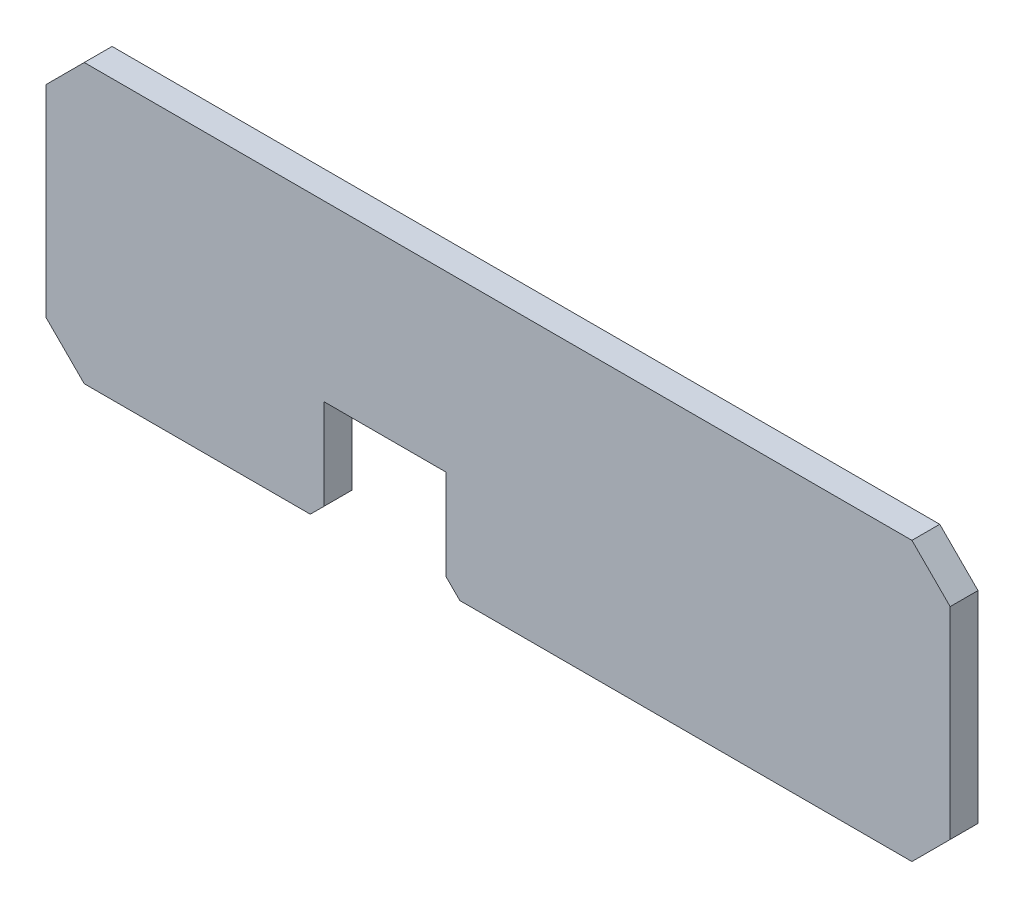
ISO-10303-21;
HEADER;
FILE_DESCRIPTION(('STEP AP214'),'2;1');
FILE_NAME('part.step','',(''),(''),'','','');
FILE_SCHEMA(('AUTOMOTIVE_DESIGN { 1 0 10303 214 1 1 1 1 }'));
ENDSEC;
DATA;
#1=APPLICATION_CONTEXT('core data for automotive mechanical design processes');
#2=APPLICATION_PROTOCOL_DEFINITION('international standard','automotive_design',2000,#1);
#3=PRODUCT_CONTEXT('',#1,'mechanical');
#4=PRODUCT('Part','Part','',(#3));
#5=PRODUCT_RELATED_PRODUCT_CATEGORY('part','',(#4));
#6=PRODUCT_DEFINITION_FORMATION('','',#4);
#7=PRODUCT_DEFINITION_CONTEXT('part definition',#1,'design');
#8=PRODUCT_DEFINITION('design','',#6,#7);
#9=PRODUCT_DEFINITION_SHAPE('','',#8);
#10=(LENGTH_UNIT() NAMED_UNIT(*) SI_UNIT(.MILLI.,.METRE.));
#11=(NAMED_UNIT(*) PLANE_ANGLE_UNIT() SI_UNIT($,.RADIAN.));
#12=(NAMED_UNIT(*) SI_UNIT($,.STERADIAN.) SOLID_ANGLE_UNIT());
#13=UNCERTAINTY_MEASURE_WITH_UNIT(LENGTH_MEASURE(1.E-05),#10,'distance_accuracy_value','');
#14=(GEOMETRIC_REPRESENTATION_CONTEXT(3) GLOBAL_UNCERTAINTY_ASSIGNED_CONTEXT((#13)) GLOBAL_UNIT_ASSIGNED_CONTEXT((#10,
#11,#12)) REPRESENTATION_CONTEXT('',''));
#15=CARTESIAN_POINT('',(0.,0.,0.));
#16=DIRECTION('',(0.,0.,1.));
#17=DIRECTION('',(1.,0.,0.));
#18=AXIS2_PLACEMENT_3D('',#15,#16,#17);
#19=CARTESIAN_POINT('',(-9.52500000000005,-22.86,5.08));
#20=DIRECTION('',(1.,0.,0.));
#21=DIRECTION('',(0.,1.,0.));
#22=AXIS2_PLACEMENT_3D('',#19,#20,#21);
#23=PLANE('',#22);
#24=DIRECTION('',(0.,-1.,0.));
#25=VECTOR('',#24,1.);
#26=CARTESIAN_POINT('',(-9.52500000000005,-22.86,0.));
#27=LINE('',#26,#25);
#28=CARTESIAN_POINT('',(-9.525,-6.35,0.));
#29=VERTEX_POINT('',#28);
#30=CARTESIAN_POINT('',(-9.52500000000005,-22.86,0.));
#31=VERTEX_POINT('',#30);
#32=EDGE_CURVE('E181',#29,#31,#27,.T.);
#33=ORIENTED_EDGE('',*,*,#32,.T.);
#34=DIRECTION('',(0.,0.,-1.));
#35=VECTOR('',#34,1.);
#36=CARTESIAN_POINT('',(-9.52500000000005,-22.86,5.08));
#37=LINE('',#36,#35);
#38=CARTESIAN_POINT('',(-9.52500000000005,-22.86,5.08));
#39=VERTEX_POINT('',#38);
#40=EDGE_CURVE('E11',#39,#31,#37,.T.);
#41=ORIENTED_EDGE('',*,*,#40,.F.);
#42=DIRECTION('',(0.,-1.,0.));
#43=VECTOR('',#42,1.);
#44=CARTESIAN_POINT('',(-9.52500000000005,-22.86,5.08));
#45=LINE('',#44,#43);
#46=CARTESIAN_POINT('',(-9.525,-6.35,5.08));
#47=VERTEX_POINT('',#46);
#48=EDGE_CURVE('E221',#47,#39,#45,.T.);
#49=ORIENTED_EDGE('',*,*,#48,.F.);
#50=DIRECTION('',(0.,0.,-1.));
#51=VECTOR('',#50,1.);
#52=CARTESIAN_POINT('',(-9.525,-6.35,5.08));
#53=LINE('',#52,#51);
#54=EDGE_CURVE('E177',#47,#29,#53,.T.);
#55=ORIENTED_EDGE('',*,*,#54,.T.);
#56=EDGE_LOOP('',(#33,#41,#49,#55));
#57=FACE_BOUND('',#56,.T.);
#58=ADVANCED_FACE('F43',(#57),#23,.F.);
#59=CARTESIAN_POINT('',(-6.98500000000006,-25.4,5.08));
#60=DIRECTION('',(0.707106781186548,0.707106781186547,0.));
#61=DIRECTION('',(-0.707106781186547,0.707106781186548,0.));
#62=AXIS2_PLACEMENT_3D('',#59,#60,#61);
#63=PLANE('',#62);
#64=DIRECTION('',(0.707106781186547,-0.707106781186548,0.));
#65=VECTOR('',#64,1.);
#66=CARTESIAN_POINT('',(-6.98500000000006,-25.4,0.));
#67=LINE('',#66,#65);
#68=CARTESIAN_POINT('',(-6.98500000000006,-25.4,0.));
#69=VERTEX_POINT('',#68);
#70=EDGE_CURVE('E185',#31,#69,#67,.T.);
#71=ORIENTED_EDGE('',*,*,#70,.T.);
#72=DIRECTION('',(0.,0.,-1.));
#73=VECTOR('',#72,1.);
#74=CARTESIAN_POINT('',(-6.98500000000006,-25.4,5.08));
#75=LINE('',#74,#73);
#76=CARTESIAN_POINT('',(-6.98500000000006,-25.4,5.08));
#77=VERTEX_POINT('',#76);
#78=EDGE_CURVE('E52',#77,#69,#75,.T.);
#79=ORIENTED_EDGE('',*,*,#78,.F.);
#80=DIRECTION('',(0.707106781186547,-0.707106781186548,0.));
#81=VECTOR('',#80,1.);
#82=CARTESIAN_POINT('',(-6.98500000000006,-25.4,5.08));
#83=LINE('',#82,#81);
#84=EDGE_CURVE('E121',#39,#77,#83,.T.);
#85=ORIENTED_EDGE('',*,*,#84,.F.);
#86=ORIENTED_EDGE('',*,*,#40,.T.);
#87=EDGE_LOOP('',(#71,#79,#85,#86));
#88=FACE_BOUND('',#87,.T.);
#89=ADVANCED_FACE('F338',(#88),#63,.F.);
#90=CARTESIAN_POINT('',(-6.98500000000006,-25.4,5.08));
#91=DIRECTION('',(0.,1.,0.));
#92=DIRECTION('',(-1.,0.,0.));
#93=AXIS2_PLACEMENT_3D('',#90,#91,#92);
#94=PLANE('',#93);
#95=DIRECTION('',(1.,0.,0.));
#96=VECTOR('',#95,1.);
#97=CARTESIAN_POINT('',(-6.98500000000006,-25.4,0.));
#98=LINE('',#97,#96);
#99=CARTESIAN_POINT('',(75.565,-25.4,0.));
#100=VERTEX_POINT('',#99);
#101=EDGE_CURVE('E188',#69,#100,#98,.T.);
#102=ORIENTED_EDGE('',*,*,#101,.T.);
#103=DIRECTION('',(0.,0.,-1.));
#104=VECTOR('',#103,1.);
#105=CARTESIAN_POINT('',(75.565,-25.4,5.08));
#106=LINE('',#105,#104);
#107=CARTESIAN_POINT('',(75.565,-25.4,5.08));
#108=VERTEX_POINT('',#107);
#109=EDGE_CURVE('E256',#108,#100,#106,.T.);
#110=ORIENTED_EDGE('',*,*,#109,.F.);
#111=DIRECTION('',(1.,0.,0.));
#112=VECTOR('',#111,1.);
#113=CARTESIAN_POINT('',(-6.98500000000006,-25.4,5.08));
#114=LINE('',#113,#112);
#115=EDGE_CURVE('E267',#77,#108,#114,.T.);
#116=ORIENTED_EDGE('',*,*,#115,.F.);
#117=ORIENTED_EDGE('',*,*,#78,.T.);
#118=EDGE_LOOP('',(#102,#110,#116,#117));
#119=FACE_BOUND('',#118,.T.);
#120=ADVANCED_FACE('F265',(#119),#94,.F.);
#121=CARTESIAN_POINT('',(75.565,-25.4,5.08));
#122=DIRECTION('',(-0.707106781186547,0.707106781186548,0.));
#123=DIRECTION('',(-0.707106781186548,-0.707106781186547,0.));
#124=AXIS2_PLACEMENT_3D('',#121,#122,#123);
#125=PLANE('',#124);
#126=DIRECTION('',(0.707106781186548,0.707106781186547,0.));
#127=VECTOR('',#126,1.);
#128=CARTESIAN_POINT('',(75.565,-25.4,0.));
#129=LINE('',#128,#127);
#130=CARTESIAN_POINT('',(82.55,-18.415,0.));
#131=VERTEX_POINT('',#130);
#132=EDGE_CURVE('E191',#100,#131,#129,.T.);
#133=ORIENTED_EDGE('',*,*,#132,.T.);
#134=DIRECTION('',(0.,0.,-1.));
#135=VECTOR('',#134,1.);
#136=CARTESIAN_POINT('',(82.55,-18.415,5.08));
#137=LINE('',#136,#135);
#138=CARTESIAN_POINT('',(82.55,-18.415,5.08));
#139=VERTEX_POINT('',#138);
#140=EDGE_CURVE('E252',#139,#131,#137,.T.);
#141=ORIENTED_EDGE('',*,*,#140,.F.);
#142=DIRECTION('',(0.707106781186548,0.707106781186547,0.));
#143=VECTOR('',#142,1.);
#144=CARTESIAN_POINT('',(75.565,-25.4,5.08));
#145=LINE('',#144,#143);
#146=EDGE_CURVE('E286',#108,#139,#145,.T.);
#147=ORIENTED_EDGE('',*,*,#146,.F.);
#148=ORIENTED_EDGE('',*,*,#109,.T.);
#149=EDGE_LOOP('',(#133,#141,#147,#148));
#150=FACE_BOUND('',#149,.T.);
#151=ADVANCED_FACE('F276',(#150),#125,.F.);
#152=CARTESIAN_POINT('',(82.55,18.415,5.08));
#153=DIRECTION('',(-1.,0.,0.));
#154=DIRECTION('',(0.,-1.,0.));
#155=AXIS2_PLACEMENT_3D('',#152,#153,#154);
#156=PLANE('',#155);
#157=DIRECTION('',(0.,1.,0.));
#158=VECTOR('',#157,1.);
#159=CARTESIAN_POINT('',(82.55,18.415,0.));
#160=LINE('',#159,#158);
#161=CARTESIAN_POINT('',(82.55,18.415,0.));
#162=VERTEX_POINT('',#161);
#163=EDGE_CURVE('E194',#131,#162,#160,.T.);
#164=ORIENTED_EDGE('',*,*,#163,.T.);
#165=DIRECTION('',(0.,0.,-1.));
#166=VECTOR('',#165,1.);
#167=CARTESIAN_POINT('',(82.55,18.415,5.08));
#168=LINE('',#167,#166);
#169=CARTESIAN_POINT('',(82.55,18.415,5.08));
#170=VERTEX_POINT('',#169);
#171=EDGE_CURVE('E248',#170,#162,#168,.T.);
#172=ORIENTED_EDGE('',*,*,#171,.F.);
#173=DIRECTION('',(0.,1.,0.));
#174=VECTOR('',#173,1.);
#175=CARTESIAN_POINT('',(82.55,18.415,5.08));
#176=LINE('',#175,#174);
#177=EDGE_CURVE('E282',#139,#170,#176,.T.);
#178=ORIENTED_EDGE('',*,*,#177,.F.);
#179=ORIENTED_EDGE('',*,*,#140,.T.);
#180=EDGE_LOOP('',(#164,#172,#178,#179));
#181=FACE_BOUND('',#180,.T.);
#182=ADVANCED_FACE('F280',(#181),#156,.F.);
#183=CARTESIAN_POINT('',(75.565,25.4,5.08));
#184=DIRECTION('',(-0.707106781186547,-0.707106781186548,0.));
#185=DIRECTION('',(0.707106781186548,-0.707106781186547,0.));
#186=AXIS2_PLACEMENT_3D('',#183,#184,#185);
#187=PLANE('',#186);
#188=DIRECTION('',(-0.707106781186548,0.707106781186547,0.));
#189=VECTOR('',#188,1.);
#190=CARTESIAN_POINT('',(75.565,25.4,0.));
#191=LINE('',#190,#189);
#192=CARTESIAN_POINT('',(75.565,25.4,0.));
#193=VERTEX_POINT('',#192);
#194=EDGE_CURVE('E197',#162,#193,#191,.T.);
#195=ORIENTED_EDGE('',*,*,#194,.T.);
#196=DIRECTION('',(0.,0.,-1.));
#197=VECTOR('',#196,1.);
#198=CARTESIAN_POINT('',(75.565,25.4,5.08));
#199=LINE('',#198,#197);
#200=CARTESIAN_POINT('',(75.565,25.4,5.08));
#201=VERTEX_POINT('',#200);
#202=EDGE_CURVE('E244',#201,#193,#199,.T.);
#203=ORIENTED_EDGE('',*,*,#202,.F.);
#204=DIRECTION('',(-0.707106781186548,0.707106781186547,0.));
#205=VECTOR('',#204,1.);
#206=CARTESIAN_POINT('',(75.565,25.4,5.08));
#207=LINE('',#206,#205);
#208=EDGE_CURVE('E285',#170,#201,#207,.T.);
#209=ORIENTED_EDGE('',*,*,#208,.F.);
#210=ORIENTED_EDGE('',*,*,#171,.T.);
#211=EDGE_LOOP('',(#195,#203,#209,#210));
#212=FACE_BOUND('',#211,.T.);
#213=ADVANCED_FACE('F351',(#212),#187,.F.);
#214=CARTESIAN_POINT('',(-75.565,25.4,5.08));
#215=DIRECTION('',(0.,-1.,0.));
#216=DIRECTION('',(1.,0.,0.));
#217=AXIS2_PLACEMENT_3D('',#214,#215,#216);
#218=PLANE('',#217);
#219=DIRECTION('',(-1.,0.,0.));
#220=VECTOR('',#219,1.);
#221=CARTESIAN_POINT('',(-75.565,25.4,0.));
#222=LINE('',#221,#220);
#223=CARTESIAN_POINT('',(-75.565,25.4,0.));
#224=VERTEX_POINT('',#223);
#225=EDGE_CURVE('E200',#193,#224,#222,.T.);
#226=ORIENTED_EDGE('',*,*,#225,.T.);
#227=DIRECTION('',(0.,0.,-1.));
#228=VECTOR('',#227,1.);
#229=CARTESIAN_POINT('',(-75.565,25.4,5.08));
#230=LINE('',#229,#228);
#231=CARTESIAN_POINT('',(-75.565,25.4,5.08));
#232=VERTEX_POINT('',#231);
#233=EDGE_CURVE('E240',#232,#224,#230,.T.);
#234=ORIENTED_EDGE('',*,*,#233,.F.);
#235=DIRECTION('',(-1.,0.,0.));
#236=VECTOR('',#235,1.);
#237=CARTESIAN_POINT('',(-75.565,25.4,5.08));
#238=LINE('',#237,#236);
#239=EDGE_CURVE('E291',#201,#232,#238,.T.);
#240=ORIENTED_EDGE('',*,*,#239,.F.);
#241=ORIENTED_EDGE('',*,*,#202,.T.);
#242=EDGE_LOOP('',(#226,#234,#240,#241));
#243=FACE_BOUND('',#242,.T.);
#244=ADVANCED_FACE('F354',(#243),#218,.F.);
#245=CARTESIAN_POINT('',(-82.55,18.415,5.08));
#246=DIRECTION('',(0.707106781186547,-0.707106781186548,0.));
#247=DIRECTION('',(0.707106781186548,0.707106781186547,0.));
#248=AXIS2_PLACEMENT_3D('',#245,#246,#247);
#249=PLANE('',#248);
#250=DIRECTION('',(-0.707106781186548,-0.707106781186547,0.));
#251=VECTOR('',#250,1.);
#252=CARTESIAN_POINT('',(-82.55,18.415,0.));
#253=LINE('',#252,#251);
#254=CARTESIAN_POINT('',(-82.55,18.415,0.));
#255=VERTEX_POINT('',#254);
#256=EDGE_CURVE('E203',#224,#255,#253,.T.);
#257=ORIENTED_EDGE('',*,*,#256,.T.);
#258=DIRECTION('',(0.,0.,-1.));
#259=VECTOR('',#258,1.);
#260=CARTESIAN_POINT('',(-82.55,18.415,5.08));
#261=LINE('',#260,#259);
#262=CARTESIAN_POINT('',(-82.55,18.415,5.08));
#263=VERTEX_POINT('',#262);
#264=EDGE_CURVE('E236',#263,#255,#261,.T.);
#265=ORIENTED_EDGE('',*,*,#264,.F.);
#266=DIRECTION('',(-0.707106781186548,-0.707106781186547,0.));
#267=VECTOR('',#266,1.);
#268=CARTESIAN_POINT('',(-82.55,18.415,5.08));
#269=LINE('',#268,#267);
#270=EDGE_CURVE('E298',#232,#263,#269,.T.);
#271=ORIENTED_EDGE('',*,*,#270,.F.);
#272=ORIENTED_EDGE('',*,*,#233,.T.);
#273=EDGE_LOOP('',(#257,#265,#271,#272));
#274=FACE_BOUND('',#273,.T.);
#275=ADVANCED_FACE('F358',(#274),#249,.F.);
#276=CARTESIAN_POINT('',(-82.55,18.415,5.08));
#277=DIRECTION('',(1.,0.,0.));
#278=DIRECTION('',(0.,0.,-1.));
#279=AXIS2_PLACEMENT_3D('',#276,#277,#278);
#280=PLANE('',#279);
#281=DIRECTION('',(0.,-1.,0.));
#282=VECTOR('',#281,1.);
#283=CARTESIAN_POINT('',(-82.55,18.415,0.));
#284=LINE('',#283,#282);
#285=CARTESIAN_POINT('',(-82.55,-18.415,0.));
#286=VERTEX_POINT('',#285);
#287=EDGE_CURVE('E206',#255,#286,#284,.T.);
#288=ORIENTED_EDGE('',*,*,#287,.T.);
#289=DIRECTION('',(0.,0.,-1.));
#290=VECTOR('',#289,1.);
#291=CARTESIAN_POINT('',(-82.55,-18.415,5.08));
#292=LINE('',#291,#290);
#293=CARTESIAN_POINT('',(-82.55,-18.415,5.08));
#294=VERTEX_POINT('',#293);
#295=EDGE_CURVE('E232',#294,#286,#292,.T.);
#296=ORIENTED_EDGE('',*,*,#295,.F.);
#297=DIRECTION('',(0.,-1.,0.));
#298=VECTOR('',#297,1.);
#299=CARTESIAN_POINT('',(-82.55,18.415,5.08));
#300=LINE('',#299,#298);
#301=EDGE_CURVE('E301',#263,#294,#300,.T.);
#302=ORIENTED_EDGE('',*,*,#301,.F.);
#303=ORIENTED_EDGE('',*,*,#264,.T.);
#304=EDGE_LOOP('',(#288,#296,#302,#303));
#305=FACE_BOUND('',#304,.T.);
#306=ADVANCED_FACE('F362',(#305),#280,.F.);
#307=CARTESIAN_POINT('',(-82.55,-18.415,5.08));
#308=DIRECTION('',(0.707106781186547,0.707106781186548,0.));
#309=DIRECTION('',(-0.707106781186548,0.707106781186547,0.));
#310=AXIS2_PLACEMENT_3D('',#307,#308,#309);
#311=PLANE('',#310);
#312=DIRECTION('',(0.707106781186548,-0.707106781186547,0.));
#313=VECTOR('',#312,1.);
#314=CARTESIAN_POINT('',(-82.55,-18.415,0.));
#315=LINE('',#314,#313);
#316=CARTESIAN_POINT('',(-75.565,-25.4,0.));
#317=VERTEX_POINT('',#316);
#318=EDGE_CURVE('E209',#286,#317,#315,.T.);
#319=ORIENTED_EDGE('',*,*,#318,.T.);
#320=DIRECTION('',(0.,0.,-1.));
#321=VECTOR('',#320,1.);
#322=CARTESIAN_POINT('',(-75.565,-25.4,5.08));
#323=LINE('',#322,#321);
#324=CARTESIAN_POINT('',(-75.565,-25.4,5.08));
#325=VERTEX_POINT('',#324);
#326=EDGE_CURVE('E228',#325,#317,#323,.T.);
#327=ORIENTED_EDGE('',*,*,#326,.F.);
#328=DIRECTION('',(0.707106781186548,-0.707106781186547,0.));
#329=VECTOR('',#328,1.);
#330=CARTESIAN_POINT('',(-82.55,-18.415,5.08));
#331=LINE('',#330,#329);
#332=EDGE_CURVE('E304',#294,#325,#331,.T.);
#333=ORIENTED_EDGE('',*,*,#332,.F.);
#334=ORIENTED_EDGE('',*,*,#295,.T.);
#335=EDGE_LOOP('',(#319,#327,#333,#334));
#336=FACE_BOUND('',#335,.T.);
#337=ADVANCED_FACE('F319',(#336),#311,.F.);
#338=CARTESIAN_POINT('',(-75.565,-25.4,5.08));
#339=DIRECTION('',(0.,1.,0.));
#340=DIRECTION('',(-1.,0.,0.));
#341=AXIS2_PLACEMENT_3D('',#338,#339,#340);
#342=PLANE('',#341);
#343=DIRECTION('',(1.,0.,0.));
#344=VECTOR('',#343,1.);
#345=CARTESIAN_POINT('',(-75.565,-25.4,0.));
#346=LINE('',#345,#344);
#347=CARTESIAN_POINT('',(-34.29,-25.4,0.));
#348=VERTEX_POINT('',#347);
#349=EDGE_CURVE('E212',#317,#348,#346,.T.);
#350=ORIENTED_EDGE('',*,*,#349,.T.);
#351=DIRECTION('',(0.,0.,-1.));
#352=VECTOR('',#351,1.);
#353=CARTESIAN_POINT('',(-34.29,-25.4,5.08));
#354=LINE('',#353,#352);
#355=CARTESIAN_POINT('',(-34.29,-25.4,5.08));
#356=VERTEX_POINT('',#355);
#357=EDGE_CURVE('E169',#356,#348,#354,.T.);
#358=ORIENTED_EDGE('',*,*,#357,.F.);
#359=DIRECTION('',(1.,0.,0.));
#360=VECTOR('',#359,1.);
#361=CARTESIAN_POINT('',(-75.565,-25.4,5.08));
#362=LINE('',#361,#360);
#363=EDGE_CURVE('E158',#325,#356,#362,.T.);
#364=ORIENTED_EDGE('',*,*,#363,.F.);
#365=ORIENTED_EDGE('',*,*,#326,.T.);
#366=EDGE_LOOP('',(#350,#358,#364,#365));
#367=FACE_BOUND('',#366,.T.);
#368=ADVANCED_FACE('F323',(#367),#342,.F.);
#369=CARTESIAN_POINT('',(-34.29,-25.4,5.08));
#370=DIRECTION('',(-0.707106781186547,0.707106781186548,0.));
#371=DIRECTION('',(-0.707106781186548,-0.707106781186547,0.));
#372=AXIS2_PLACEMENT_3D('',#369,#370,#371);
#373=PLANE('',#372);
#374=DIRECTION('',(0.707106781186548,0.707106781186547,0.));
#375=VECTOR('',#374,1.);
#376=CARTESIAN_POINT('',(-34.29,-25.4,0.));
#377=LINE('',#376,#375);
#378=CARTESIAN_POINT('',(-31.75,-22.86,0.));
#379=VERTEX_POINT('',#378);
#380=EDGE_CURVE('E167',#348,#379,#377,.T.);
#381=ORIENTED_EDGE('',*,*,#380,.T.);
#382=DIRECTION('',(0.,0.,-1.));
#383=VECTOR('',#382,1.);
#384=CARTESIAN_POINT('',(-31.75,-22.86,5.08));
#385=LINE('',#384,#383);
#386=CARTESIAN_POINT('',(-31.75,-22.86,5.08));
#387=VERTEX_POINT('',#386);
#388=EDGE_CURVE('E164',#387,#379,#385,.T.);
#389=ORIENTED_EDGE('',*,*,#388,.F.);
#390=DIRECTION('',(0.707106781186548,0.707106781186547,0.));
#391=VECTOR('',#390,1.);
#392=CARTESIAN_POINT('',(-34.29,-25.4,5.08));
#393=LINE('',#392,#391);
#394=EDGE_CURVE('E152',#356,#387,#393,.T.);
#395=ORIENTED_EDGE('',*,*,#394,.F.);
#396=ORIENTED_EDGE('',*,*,#357,.T.);
#397=EDGE_LOOP('',(#381,#389,#395,#396));
#398=FACE_BOUND('',#397,.T.);
#399=ADVANCED_FACE('F165',(#398),#373,.F.);
#400=CARTESIAN_POINT('',(-31.75,-22.86,5.08));
#401=DIRECTION('',(-1.,0.,0.));
#402=DIRECTION('',(0.,-1.,0.));
#403=AXIS2_PLACEMENT_3D('',#400,#401,#402);
#404=PLANE('',#403);
#405=DIRECTION('',(0.,1.,0.));
#406=VECTOR('',#405,1.);
#407=CARTESIAN_POINT('',(-31.75,-22.86,0.));
#408=LINE('',#407,#406);
#409=CARTESIAN_POINT('',(-31.75,-6.35,0.));
#410=VERTEX_POINT('',#409);
#411=EDGE_CURVE('E107',#379,#410,#408,.T.);
#412=ORIENTED_EDGE('',*,*,#411,.T.);
#413=DIRECTION('',(0.,0.,-1.));
#414=VECTOR('',#413,1.);
#415=CARTESIAN_POINT('',(-31.75,-6.35,5.08));
#416=LINE('',#415,#414);
#417=CARTESIAN_POINT('',(-31.75,-6.35,5.08));
#418=VERTEX_POINT('',#417);
#419=EDGE_CURVE('E170',#418,#410,#416,.T.);
#420=ORIENTED_EDGE('',*,*,#419,.F.);
#421=DIRECTION('',(0.,1.,0.));
#422=VECTOR('',#421,1.);
#423=CARTESIAN_POINT('',(-31.75,-22.86,5.08));
#424=LINE('',#423,#422);
#425=EDGE_CURVE('E156',#387,#418,#424,.T.);
#426=ORIENTED_EDGE('',*,*,#425,.F.);
#427=ORIENTED_EDGE('',*,*,#388,.T.);
#428=EDGE_LOOP('',(#412,#420,#426,#427));
#429=FACE_BOUND('',#428,.T.);
#430=ADVANCED_FACE('F172',(#429),#404,.F.);
#431=CARTESIAN_POINT('',(-31.75,-6.35,5.08));
#432=DIRECTION('',(0.,1.,0.));
#433=DIRECTION('',(0.,0.,1.));
#434=AXIS2_PLACEMENT_3D('',#431,#432,#433);
#435=PLANE('',#434);
#436=DIRECTION('',(1.,0.,0.));
#437=VECTOR('',#436,1.);
#438=CARTESIAN_POINT('',(-31.75,-6.35,0.));
#439=LINE('',#438,#437);
#440=EDGE_CURVE('E113',#410,#29,#439,.T.);
#441=ORIENTED_EDGE('',*,*,#440,.T.);
#442=ORIENTED_EDGE('',*,*,#54,.F.);
#443=DIRECTION('',(1.,0.,0.));
#444=VECTOR('',#443,1.);
#445=CARTESIAN_POINT('',(-31.75,-6.35,5.08));
#446=LINE('',#445,#444);
#447=EDGE_CURVE('E60',#418,#47,#446,.T.);
#448=ORIENTED_EDGE('',*,*,#447,.F.);
#449=ORIENTED_EDGE('',*,*,#419,.T.);
#450=EDGE_LOOP('',(#441,#442,#448,#449));
#451=FACE_BOUND('',#450,.T.);
#452=ADVANCED_FACE('F327',(#451),#435,.F.);
#453=CARTESIAN_POINT('',(0.,0.,5.08));
#454=DIRECTION('',(0.,0.,-1.));
#455=DIRECTION('',(-1.,0.,0.));
#456=AXIS2_PLACEMENT_3D('',#453,#454,#455);
#457=PLANE('',#456);
#458=ORIENTED_EDGE('',*,*,#48,.T.);
#459=ORIENTED_EDGE('',*,*,#84,.T.);
#460=ORIENTED_EDGE('',*,*,#115,.T.);
#461=ORIENTED_EDGE('',*,*,#146,.T.);
#462=ORIENTED_EDGE('',*,*,#177,.T.);
#463=ORIENTED_EDGE('',*,*,#208,.T.);
#464=ORIENTED_EDGE('',*,*,#239,.T.);
#465=ORIENTED_EDGE('',*,*,#270,.T.);
#466=ORIENTED_EDGE('',*,*,#301,.T.);
#467=ORIENTED_EDGE('',*,*,#332,.T.);
#468=ORIENTED_EDGE('',*,*,#363,.T.);
#469=ORIENTED_EDGE('',*,*,#394,.T.);
#470=ORIENTED_EDGE('',*,*,#425,.T.);
#471=ORIENTED_EDGE('',*,*,#447,.T.);
#472=EDGE_LOOP('',(#458,#459,#460,#461,#462,#463,#464,#465,#466,#467,#468,#469,#470,#471));
#473=FACE_BOUND('',#472,.T.);
#474=ADVANCED_FACE('F154',(#473),#457,.F.);
#475=CARTESIAN_POINT('',(0.,0.,0.));
#476=DIRECTION('',(0.,0.,-1.));
#477=DIRECTION('',(-1.,0.,0.));
#478=AXIS2_PLACEMENT_3D('',#475,#476,#477);
#479=PLANE('',#478);
#480=ORIENTED_EDGE('',*,*,#32,.F.);
#481=ORIENTED_EDGE('',*,*,#440,.F.);
#482=ORIENTED_EDGE('',*,*,#411,.F.);
#483=ORIENTED_EDGE('',*,*,#380,.F.);
#484=ORIENTED_EDGE('',*,*,#349,.F.);
#485=ORIENTED_EDGE('',*,*,#318,.F.);
#486=ORIENTED_EDGE('',*,*,#287,.F.);
#487=ORIENTED_EDGE('',*,*,#256,.F.);
#488=ORIENTED_EDGE('',*,*,#225,.F.);
#489=ORIENTED_EDGE('',*,*,#194,.F.);
#490=ORIENTED_EDGE('',*,*,#163,.F.);
#491=ORIENTED_EDGE('',*,*,#132,.F.);
#492=ORIENTED_EDGE('',*,*,#101,.F.);
#493=ORIENTED_EDGE('',*,*,#70,.F.);
#494=EDGE_LOOP('',(#480,#481,#482,#483,#484,#485,#486,#487,#488,#489,#490,#491,#492,#493));
#495=FACE_BOUND('',#494,.T.);
#496=ADVANCED_FACE('F271',(#495),#479,.T.);
#497=CLOSED_SHELL('',(#58,#89,#120,#151,#182,#213,#244,#275,#306,#337,#368,#399,#430,#452,#474,#496));
#498=MANIFOLD_SOLID_BREP('B2',#497);
#499=ADVANCED_BREP_SHAPE_REPRESENTATION('',(#18,#498),#14);
#500=SHAPE_DEFINITION_REPRESENTATION(#9,#499);
ENDSEC;
END-ISO-10303-21;
